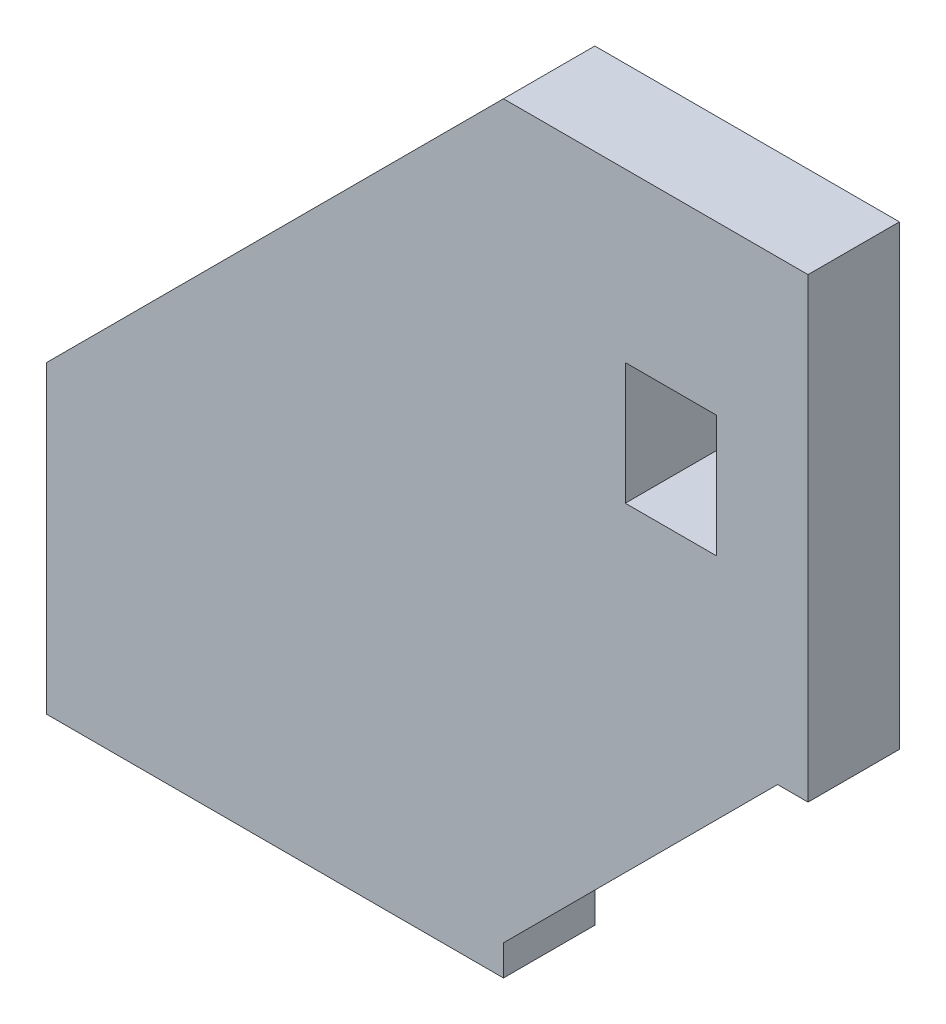
ISO-10303-21;
HEADER;
FILE_DESCRIPTION(('STEP AP214'),'2;1');
FILE_NAME('part.step','',(''),(''),'','','');
FILE_SCHEMA(('AUTOMOTIVE_DESIGN { 1 0 10303 214 1 1 1 1 }'));
ENDSEC;
DATA;
#1=APPLICATION_CONTEXT('core data for automotive mechanical design processes');
#2=APPLICATION_PROTOCOL_DEFINITION('international standard','automotive_design',2000,#1);
#3=PRODUCT_CONTEXT('',#1,'mechanical');
#4=PRODUCT('Part','Part','',(#3));
#5=PRODUCT_RELATED_PRODUCT_CATEGORY('part','',(#4));
#6=PRODUCT_DEFINITION_FORMATION('','',#4);
#7=PRODUCT_DEFINITION_CONTEXT('part definition',#1,'design');
#8=PRODUCT_DEFINITION('design','',#6,#7);
#9=PRODUCT_DEFINITION_SHAPE('','',#8);
#10=(LENGTH_UNIT() NAMED_UNIT(*) SI_UNIT(.MILLI.,.METRE.));
#11=(NAMED_UNIT(*) PLANE_ANGLE_UNIT() SI_UNIT($,.RADIAN.));
#12=(NAMED_UNIT(*) SI_UNIT($,.STERADIAN.) SOLID_ANGLE_UNIT());
#13=UNCERTAINTY_MEASURE_WITH_UNIT(LENGTH_MEASURE(1.E-05),#10,'distance_accuracy_value','');
#14=(GEOMETRIC_REPRESENTATION_CONTEXT(3) GLOBAL_UNCERTAINTY_ASSIGNED_CONTEXT((#13)) GLOBAL_UNIT_ASSIGNED_CONTEXT((#10,
#11,#12)) REPRESENTATION_CONTEXT('',''));
#15=CARTESIAN_POINT('',(0.,0.,0.));
#16=DIRECTION('',(0.,0.,1.));
#17=DIRECTION('',(1.,0.,0.));
#18=AXIS2_PLACEMENT_3D('',#15,#16,#17);
#19=CARTESIAN_POINT('',(0.,0.,0.15));
#20=DIRECTION('',(0.,1.,0.));
#21=DIRECTION('',(-1.,0.,0.));
#22=AXIS2_PLACEMENT_3D('',#19,#20,#21);
#23=PLANE('',#22);
#24=DIRECTION('',(1.,0.,0.));
#25=VECTOR('',#24,1.);
#26=CARTESIAN_POINT('',(0.,0.,-0.15));
#27=LINE('',#26,#25);
#28=CARTESIAN_POINT('',(-0.1,0.,-0.15));
#29=VERTEX_POINT('',#28);
#30=CARTESIAN_POINT('',(0.,0.,-0.15));
#31=VERTEX_POINT('',#30);
#32=EDGE_CURVE('E154',#29,#31,#27,.T.);
#33=ORIENTED_EDGE('',*,*,#32,.T.);
#34=DIRECTION('',(0.,0.,-1.));
#35=VECTOR('',#34,1.);
#36=CARTESIAN_POINT('',(0.,0.,0.15));
#37=LINE('',#36,#35);
#38=CARTESIAN_POINT('',(0.,0.,0.15));
#39=VERTEX_POINT('',#38);
#40=EDGE_CURVE('E11',#39,#31,#37,.T.);
#41=ORIENTED_EDGE('',*,*,#40,.F.);
#42=DIRECTION('',(1.,0.,0.));
#43=VECTOR('',#42,1.);
#44=CARTESIAN_POINT('',(0.,0.,0.15));
#45=LINE('',#44,#43);
#46=CARTESIAN_POINT('',(-0.1,0.,0.15));
#47=VERTEX_POINT('',#46);
#48=EDGE_CURVE('E158',#47,#39,#45,.T.);
#49=ORIENTED_EDGE('',*,*,#48,.F.);
#50=DIRECTION('',(0.,0.,-1.));
#51=VECTOR('',#50,1.);
#52=CARTESIAN_POINT('',(-0.1,0.,0.15));
#53=LINE('',#52,#51);
#54=EDGE_CURVE('E176',#47,#29,#53,.T.);
#55=ORIENTED_EDGE('',*,*,#54,.T.);
#56=EDGE_LOOP('',(#33,#41,#49,#55));
#57=FACE_BOUND('',#56,.T.);
#58=ADVANCED_FACE('F33',(#57),#23,.F.);
#59=CARTESIAN_POINT('',(0.,0.,0.15));
#60=DIRECTION('',(-1.,0.,0.));
#61=DIRECTION('',(0.,0.,1.));
#62=AXIS2_PLACEMENT_3D('',#59,#60,#61);
#63=PLANE('',#62);
#64=DIRECTION('',(0.,1.,0.));
#65=VECTOR('',#64,1.);
#66=CARTESIAN_POINT('',(0.,0.,-0.15));
#67=LINE('',#66,#65);
#68=CARTESIAN_POINT('',(0.,1.5,-0.15));
#69=VERTEX_POINT('',#68);
#70=EDGE_CURVE('E179',#31,#69,#67,.T.);
#71=ORIENTED_EDGE('',*,*,#70,.T.);
#72=DIRECTION('',(0.,0.,-1.));
#73=VECTOR('',#72,1.);
#74=CARTESIAN_POINT('',(0.,1.5,0.15));
#75=LINE('',#74,#73);
#76=CARTESIAN_POINT('',(0.,1.5,0.15));
#77=VERTEX_POINT('',#76);
#78=EDGE_CURVE('E40',#77,#69,#75,.T.);
#79=ORIENTED_EDGE('',*,*,#78,.F.);
#80=DIRECTION('',(0.,1.,0.));
#81=VECTOR('',#80,1.);
#82=CARTESIAN_POINT('',(0.,0.,0.15));
#83=LINE('',#82,#81);
#84=EDGE_CURVE('E161',#39,#77,#83,.T.);
#85=ORIENTED_EDGE('',*,*,#84,.F.);
#86=ORIENTED_EDGE('',*,*,#40,.T.);
#87=EDGE_LOOP('',(#71,#79,#85,#86));
#88=FACE_BOUND('',#87,.T.);
#89=ADVANCED_FACE('F234',(#88),#63,.F.);
#90=CARTESIAN_POINT('',(0.,1.5,0.15));
#91=DIRECTION('',(0.,-1.,0.));
#92=DIRECTION('',(1.,0.,0.));
#93=AXIS2_PLACEMENT_3D('',#90,#91,#92);
#94=PLANE('',#93);
#95=DIRECTION('',(-1.,0.,0.));
#96=VECTOR('',#95,1.);
#97=CARTESIAN_POINT('',(0.,1.5,-0.15));
#98=LINE('',#97,#96);
#99=CARTESIAN_POINT('',(-1.,1.5,-0.15));
#100=VERTEX_POINT('',#99);
#101=EDGE_CURVE('E181',#69,#100,#98,.T.);
#102=ORIENTED_EDGE('',*,*,#101,.T.);
#103=DIRECTION('',(0.,0.,-1.));
#104=VECTOR('',#103,1.);
#105=CARTESIAN_POINT('',(-1.,1.5,0.15));
#106=LINE('',#105,#104);
#107=CARTESIAN_POINT('',(-1.,1.5,0.15));
#108=VERTEX_POINT('',#107);
#109=EDGE_CURVE('E206',#108,#100,#106,.T.);
#110=ORIENTED_EDGE('',*,*,#109,.F.);
#111=DIRECTION('',(-1.,0.,0.));
#112=VECTOR('',#111,1.);
#113=CARTESIAN_POINT('',(0.,1.5,0.15));
#114=LINE('',#113,#112);
#115=EDGE_CURVE('E164',#77,#108,#114,.T.);
#116=ORIENTED_EDGE('',*,*,#115,.F.);
#117=ORIENTED_EDGE('',*,*,#78,.T.);
#118=EDGE_LOOP('',(#102,#110,#116,#117));
#119=FACE_BOUND('',#118,.T.);
#120=ADVANCED_FACE('F213',(#119),#94,.F.);
#121=CARTESIAN_POINT('',(-1.,1.5,0.15));
#122=DIRECTION('',(0.707106781186548,-0.707106781186547,0.));
#123=DIRECTION('',(0.707106781186547,0.707106781186548,0.));
#124=AXIS2_PLACEMENT_3D('',#121,#122,#123);
#125=PLANE('',#124);
#126=DIRECTION('',(-0.707106781186548,-0.707106781186548,0.));
#127=VECTOR('',#126,1.);
#128=CARTESIAN_POINT('',(-1.,1.5,-0.15));
#129=LINE('',#128,#127);
#130=CARTESIAN_POINT('',(-2.5,0.,-0.15));
#131=VERTEX_POINT('',#130);
#132=EDGE_CURVE('E183',#100,#131,#129,.T.);
#133=ORIENTED_EDGE('',*,*,#132,.T.);
#134=DIRECTION('',(0.,0.,-1.));
#135=VECTOR('',#134,1.);
#136=CARTESIAN_POINT('',(-2.5,0.,0.15));
#137=LINE('',#136,#135);
#138=CARTESIAN_POINT('',(-2.5,0.,0.15));
#139=VERTEX_POINT('',#138);
#140=EDGE_CURVE('E203',#139,#131,#137,.T.);
#141=ORIENTED_EDGE('',*,*,#140,.F.);
#142=DIRECTION('',(-0.707106781186548,-0.707106781186548,0.));
#143=VECTOR('',#142,1.);
#144=CARTESIAN_POINT('',(-1.,1.5,0.15));
#145=LINE('',#144,#143);
#146=EDGE_CURVE('E166',#108,#139,#145,.T.);
#147=ORIENTED_EDGE('',*,*,#146,.F.);
#148=ORIENTED_EDGE('',*,*,#109,.T.);
#149=EDGE_LOOP('',(#133,#141,#147,#148));
#150=FACE_BOUND('',#149,.T.);
#151=ADVANCED_FACE('F222',(#150),#125,.F.);
#152=CARTESIAN_POINT('',(-2.5,0.,0.15));
#153=DIRECTION('',(1.,0.,0.));
#154=DIRECTION('',(0.,1.,0.));
#155=AXIS2_PLACEMENT_3D('',#152,#153,#154);
#156=PLANE('',#155);
#157=DIRECTION('',(0.,-1.,0.));
#158=VECTOR('',#157,1.);
#159=CARTESIAN_POINT('',(-2.5,0.,-0.15));
#160=LINE('',#159,#158);
#161=CARTESIAN_POINT('',(-2.5,-1.,-0.15));
#162=VERTEX_POINT('',#161);
#163=EDGE_CURVE('E185',#131,#162,#160,.T.);
#164=ORIENTED_EDGE('',*,*,#163,.T.);
#165=DIRECTION('',(0.,0.,-1.));
#166=VECTOR('',#165,1.);
#167=CARTESIAN_POINT('',(-2.5,-1.,0.15));
#168=LINE('',#167,#166);
#169=CARTESIAN_POINT('',(-2.5,-1.,0.15));
#170=VERTEX_POINT('',#169);
#171=EDGE_CURVE('E200',#170,#162,#168,.T.);
#172=ORIENTED_EDGE('',*,*,#171,.F.);
#173=DIRECTION('',(0.,-1.,0.));
#174=VECTOR('',#173,1.);
#175=CARTESIAN_POINT('',(-2.5,0.,0.15));
#176=LINE('',#175,#174);
#177=EDGE_CURVE('E168',#139,#170,#176,.T.);
#178=ORIENTED_EDGE('',*,*,#177,.F.);
#179=ORIENTED_EDGE('',*,*,#140,.T.);
#180=EDGE_LOOP('',(#164,#172,#178,#179));
#181=FACE_BOUND('',#180,.T.);
#182=ADVANCED_FACE('F226',(#181),#156,.F.);
#183=CARTESIAN_POINT('',(-2.5,-1.,0.15));
#184=DIRECTION('',(0.,1.,0.));
#185=DIRECTION('',(0.,0.,1.));
#186=AXIS2_PLACEMENT_3D('',#183,#184,#185);
#187=PLANE('',#186);
#188=DIRECTION('',(1.,0.,0.));
#189=VECTOR('',#188,1.);
#190=CARTESIAN_POINT('',(-2.5,-1.,-0.15));
#191=LINE('',#190,#189);
#192=CARTESIAN_POINT('',(-1.,-1.,-0.15));
#193=VERTEX_POINT('',#192);
#194=EDGE_CURVE('E187',#162,#193,#191,.T.);
#195=ORIENTED_EDGE('',*,*,#194,.T.);
#196=DIRECTION('',(0.,0.,-1.));
#197=VECTOR('',#196,1.);
#198=CARTESIAN_POINT('',(-1.,-1.,0.15));
#199=LINE('',#198,#197);
#200=CARTESIAN_POINT('',(-1.,-1.,0.15));
#201=VERTEX_POINT('',#200);
#202=EDGE_CURVE('E197',#201,#193,#199,.T.);
#203=ORIENTED_EDGE('',*,*,#202,.F.);
#204=DIRECTION('',(1.,0.,0.));
#205=VECTOR('',#204,1.);
#206=CARTESIAN_POINT('',(-2.5,-1.,0.15));
#207=LINE('',#206,#205);
#208=EDGE_CURVE('E170',#170,#201,#207,.T.);
#209=ORIENTED_EDGE('',*,*,#208,.F.);
#210=ORIENTED_EDGE('',*,*,#171,.T.);
#211=EDGE_LOOP('',(#195,#203,#209,#210));
#212=FACE_BOUND('',#211,.T.);
#213=ADVANCED_FACE('F247',(#212),#187,.F.);
#214=CARTESIAN_POINT('',(-1.,-0.900000000000001,0.15));
#215=DIRECTION('',(-1.,0.,0.));
#216=DIRECTION('',(0.,0.,1.));
#217=AXIS2_PLACEMENT_3D('',#214,#215,#216);
#218=PLANE('',#217);
#219=DIRECTION('',(0.,1.,0.));
#220=VECTOR('',#219,1.);
#221=CARTESIAN_POINT('',(-1.,-0.900000000000001,-0.15));
#222=LINE('',#221,#220);
#223=CARTESIAN_POINT('',(-1.,-0.900000000000001,-0.15));
#224=VERTEX_POINT('',#223);
#225=EDGE_CURVE('E189',#193,#224,#222,.T.);
#226=ORIENTED_EDGE('',*,*,#225,.T.);
#227=DIRECTION('',(0.,0.,-1.));
#228=VECTOR('',#227,1.);
#229=CARTESIAN_POINT('',(-1.,-0.900000000000001,0.15));
#230=LINE('',#229,#228);
#231=CARTESIAN_POINT('',(-1.,-0.900000000000001,0.15));
#232=VERTEX_POINT('',#231);
#233=EDGE_CURVE('E194',#232,#224,#230,.T.);
#234=ORIENTED_EDGE('',*,*,#233,.F.);
#235=DIRECTION('',(0.,1.,0.));
#236=VECTOR('',#235,1.);
#237=CARTESIAN_POINT('',(-1.,-0.900000000000001,0.15));
#238=LINE('',#237,#236);
#239=EDGE_CURVE('E172',#201,#232,#238,.T.);
#240=ORIENTED_EDGE('',*,*,#239,.F.);
#241=ORIENTED_EDGE('',*,*,#202,.T.);
#242=EDGE_LOOP('',(#226,#234,#240,#241));
#243=FACE_BOUND('',#242,.T.);
#244=ADVANCED_FACE('F245',(#243),#218,.F.);
#245=CARTESIAN_POINT('',(-0.1,0.,0.15));
#246=DIRECTION('',(-0.707106781186548,0.707106781186547,0.));
#247=DIRECTION('',(-0.707106781186547,-0.707106781186548,0.));
#248=AXIS2_PLACEMENT_3D('',#245,#246,#247);
#249=PLANE('',#248);
#250=DIRECTION('',(0.707106781186547,0.707106781186548,0.));
#251=VECTOR('',#250,1.);
#252=CARTESIAN_POINT('',(-0.1,0.,-0.15));
#253=LINE('',#252,#251);
#254=EDGE_CURVE('E162',#224,#29,#253,.T.);
#255=ORIENTED_EDGE('',*,*,#254,.T.);
#256=ORIENTED_EDGE('',*,*,#54,.F.);
#257=DIRECTION('',(0.707106781186547,0.707106781186548,0.));
#258=VECTOR('',#257,1.);
#259=CARTESIAN_POINT('',(-0.1,0.,0.15));
#260=LINE('',#259,#258);
#261=EDGE_CURVE('E174',#232,#47,#260,.T.);
#262=ORIENTED_EDGE('',*,*,#261,.F.);
#263=ORIENTED_EDGE('',*,*,#233,.T.);
#264=EDGE_LOOP('',(#255,#256,#262,#263));
#265=FACE_BOUND('',#264,.T.);
#266=ADVANCED_FACE('F240',(#265),#249,.F.);
#267=CARTESIAN_POINT('',(0.,0.,0.15));
#268=DIRECTION('',(0.,0.,1.));
#269=DIRECTION('',(1.,0.,0.));
#270=AXIS2_PLACEMENT_3D('',#267,#268,#269);
#271=PLANE('',#270);
#272=DIRECTION('',(0.,1.,0.));
#273=VECTOR('',#272,1.);
#274=CARTESIAN_POINT('',(-0.3,0.95,0.15));
#275=LINE('',#274,#273);
#276=CARTESIAN_POINT('',(-0.3,0.55,0.15));
#277=VERTEX_POINT('',#276);
#278=CARTESIAN_POINT('',(-0.3,0.95,0.15));
#279=VERTEX_POINT('',#278);
#280=EDGE_CURVE('E47',#277,#279,#275,.T.);
#281=ORIENTED_EDGE('',*,*,#280,.F.);
#282=DIRECTION('',(1.,0.,0.));
#283=VECTOR('',#282,1.);
#284=CARTESIAN_POINT('',(-0.3,0.55,0.15));
#285=LINE('',#284,#283);
#286=CARTESIAN_POINT('',(-0.6,0.55,0.15));
#287=VERTEX_POINT('',#286);
#288=EDGE_CURVE('E139',#287,#277,#285,.T.);
#289=ORIENTED_EDGE('',*,*,#288,.F.);
#290=DIRECTION('',(0.,-1.,0.));
#291=VECTOR('',#290,1.);
#292=CARTESIAN_POINT('',(-0.6,0.95,0.15));
#293=LINE('',#292,#291);
#294=CARTESIAN_POINT('',(-0.6,0.95,0.15));
#295=VERTEX_POINT('',#294);
#296=EDGE_CURVE('E142',#295,#287,#293,.T.);
#297=ORIENTED_EDGE('',*,*,#296,.F.);
#298=DIRECTION('',(-1.,0.,0.));
#299=VECTOR('',#298,1.);
#300=CARTESIAN_POINT('',(-0.3,0.95,0.15));
#301=LINE('',#300,#299);
#302=EDGE_CURVE('E148',#279,#295,#301,.T.);
#303=ORIENTED_EDGE('',*,*,#302,.F.);
#304=EDGE_LOOP('',(#281,#289,#297,#303));
#305=FACE_BOUND('',#304,.T.);
#306=ORIENTED_EDGE('',*,*,#48,.T.);
#307=ORIENTED_EDGE('',*,*,#84,.T.);
#308=ORIENTED_EDGE('',*,*,#115,.T.);
#309=ORIENTED_EDGE('',*,*,#146,.T.);
#310=ORIENTED_EDGE('',*,*,#177,.T.);
#311=ORIENTED_EDGE('',*,*,#208,.T.);
#312=ORIENTED_EDGE('',*,*,#239,.T.);
#313=ORIENTED_EDGE('',*,*,#261,.T.);
#314=EDGE_LOOP('',(#306,#307,#308,#309,#310,#311,#312,#313));
#315=FACE_BOUND('',#314,.T.);
#316=ADVANCED_FACE('F230',(#305,#315),#271,.T.);
#317=CARTESIAN_POINT('',(0.,0.,-0.15));
#318=DIRECTION('',(0.,0.,1.));
#319=DIRECTION('',(1.,0.,0.));
#320=AXIS2_PLACEMENT_3D('',#317,#318,#319);
#321=PLANE('',#320);
#322=DIRECTION('',(1.,0.,0.));
#323=VECTOR('',#322,1.);
#324=CARTESIAN_POINT('',(-0.3,0.55,-0.15));
#325=LINE('',#324,#323);
#326=CARTESIAN_POINT('',(-0.6,0.55,-0.15));
#327=VERTEX_POINT('',#326);
#328=CARTESIAN_POINT('',(-0.3,0.55,-0.15));
#329=VERTEX_POINT('',#328);
#330=EDGE_CURVE('E129',#327,#329,#325,.T.);
#331=ORIENTED_EDGE('',*,*,#330,.T.);
#332=DIRECTION('',(0.,1.,0.));
#333=VECTOR('',#332,1.);
#334=CARTESIAN_POINT('',(-0.3,0.95,-0.15));
#335=LINE('',#334,#333);
#336=CARTESIAN_POINT('',(-0.3,0.95,-0.15));
#337=VERTEX_POINT('',#336);
#338=EDGE_CURVE('E123',#329,#337,#335,.T.);
#339=ORIENTED_EDGE('',*,*,#338,.T.);
#340=DIRECTION('',(-1.,0.,0.));
#341=VECTOR('',#340,1.);
#342=CARTESIAN_POINT('',(-0.3,0.95,-0.15));
#343=LINE('',#342,#341);
#344=CARTESIAN_POINT('',(-0.6,0.95,-0.15));
#345=VERTEX_POINT('',#344);
#346=EDGE_CURVE('E132',#337,#345,#343,.T.);
#347=ORIENTED_EDGE('',*,*,#346,.T.);
#348=DIRECTION('',(0.,-1.,0.));
#349=VECTOR('',#348,1.);
#350=CARTESIAN_POINT('',(-0.6,0.95,-0.15));
#351=LINE('',#350,#349);
#352=EDGE_CURVE('E55',#345,#327,#351,.T.);
#353=ORIENTED_EDGE('',*,*,#352,.T.);
#354=EDGE_LOOP('',(#331,#339,#347,#353));
#355=FACE_BOUND('',#354,.T.);
#356=ORIENTED_EDGE('',*,*,#32,.F.);
#357=ORIENTED_EDGE('',*,*,#254,.F.);
#358=ORIENTED_EDGE('',*,*,#225,.F.);
#359=ORIENTED_EDGE('',*,*,#194,.F.);
#360=ORIENTED_EDGE('',*,*,#163,.F.);
#361=ORIENTED_EDGE('',*,*,#132,.F.);
#362=ORIENTED_EDGE('',*,*,#101,.F.);
#363=ORIENTED_EDGE('',*,*,#70,.F.);
#364=EDGE_LOOP('',(#356,#357,#358,#359,#360,#361,#362,#363));
#365=FACE_BOUND('',#364,.T.);
#366=ADVANCED_FACE('F136',(#355,#365),#321,.F.);
#367=CARTESIAN_POINT('',(-0.3,0.95,-0.15));
#368=DIRECTION('',(1.,0.,0.));
#369=DIRECTION('',(0.,0.,-1.));
#370=AXIS2_PLACEMENT_3D('',#367,#368,#369);
#371=PLANE('',#370);
#372=ORIENTED_EDGE('',*,*,#280,.T.);
#373=DIRECTION('',(0.,0.,1.));
#374=VECTOR('',#373,1.);
#375=CARTESIAN_POINT('',(-0.3,0.95,-0.15));
#376=LINE('',#375,#374);
#377=EDGE_CURVE('E119',#337,#279,#376,.T.);
#378=ORIENTED_EDGE('',*,*,#377,.F.);
#379=ORIENTED_EDGE('',*,*,#338,.F.);
#380=DIRECTION('',(0.,0.,1.));
#381=VECTOR('',#380,1.);
#382=CARTESIAN_POINT('',(-0.3,0.55,-0.15));
#383=LINE('',#382,#381);
#384=EDGE_CURVE('E152',#329,#277,#383,.T.);
#385=ORIENTED_EDGE('',*,*,#384,.T.);
#386=EDGE_LOOP('',(#372,#378,#379,#385));
#387=FACE_BOUND('',#386,.T.);
#388=ADVANCED_FACE('F121',(#387),#371,.F.);
#389=CARTESIAN_POINT('',(-0.3,0.55,-0.15));
#390=DIRECTION('',(0.,-1.,0.));
#391=DIRECTION('',(0.,0.,-1.));
#392=AXIS2_PLACEMENT_3D('',#389,#390,#391);
#393=PLANE('',#392);
#394=ORIENTED_EDGE('',*,*,#288,.T.);
#395=ORIENTED_EDGE('',*,*,#384,.F.);
#396=ORIENTED_EDGE('',*,*,#330,.F.);
#397=DIRECTION('',(0.,0.,1.));
#398=VECTOR('',#397,1.);
#399=CARTESIAN_POINT('',(-0.6,0.55,-0.15));
#400=LINE('',#399,#398);
#401=EDGE_CURVE('E155',#327,#287,#400,.T.);
#402=ORIENTED_EDGE('',*,*,#401,.T.);
#403=EDGE_LOOP('',(#394,#395,#396,#402));
#404=FACE_BOUND('',#403,.T.);
#405=ADVANCED_FACE('F318',(#404),#393,.F.);
#406=CARTESIAN_POINT('',(-0.6,0.95,-0.15));
#407=DIRECTION('',(-1.,0.,0.));
#408=DIRECTION('',(0.,0.,1.));
#409=AXIS2_PLACEMENT_3D('',#406,#407,#408);
#410=PLANE('',#409);
#411=ORIENTED_EDGE('',*,*,#296,.T.);
#412=ORIENTED_EDGE('',*,*,#401,.F.);
#413=ORIENTED_EDGE('',*,*,#352,.F.);
#414=DIRECTION('',(0.,0.,1.));
#415=VECTOR('',#414,1.);
#416=CARTESIAN_POINT('',(-0.6,0.95,-0.15));
#417=LINE('',#416,#415);
#418=EDGE_CURVE('E128',#345,#295,#417,.T.);
#419=ORIENTED_EDGE('',*,*,#418,.T.);
#420=EDGE_LOOP('',(#411,#412,#413,#419));
#421=FACE_BOUND('',#420,.T.);
#422=ADVANCED_FACE('F327',(#421),#410,.F.);
#423=CARTESIAN_POINT('',(-0.3,0.95,-0.15));
#424=DIRECTION('',(0.,1.,0.));
#425=DIRECTION('',(0.,0.,1.));
#426=AXIS2_PLACEMENT_3D('',#423,#424,#425);
#427=PLANE('',#426);
#428=ORIENTED_EDGE('',*,*,#302,.T.);
#429=ORIENTED_EDGE('',*,*,#418,.F.);
#430=ORIENTED_EDGE('',*,*,#346,.F.);
#431=ORIENTED_EDGE('',*,*,#377,.T.);
#432=EDGE_LOOP('',(#428,#429,#430,#431));
#433=FACE_BOUND('',#432,.T.);
#434=ADVANCED_FACE('F133',(#433),#427,.F.);
#435=CLOSED_SHELL('',(#58,#89,#120,#151,#182,#213,#244,#266,#316,#366,#388,#405,#422,#434));
#436=MANIFOLD_SOLID_BREP('B2',#435);
#437=ADVANCED_BREP_SHAPE_REPRESENTATION('',(#18,#436),#14);
#438=SHAPE_DEFINITION_REPRESENTATION(#9,#437);
ENDSEC;
END-ISO-10303-21;
